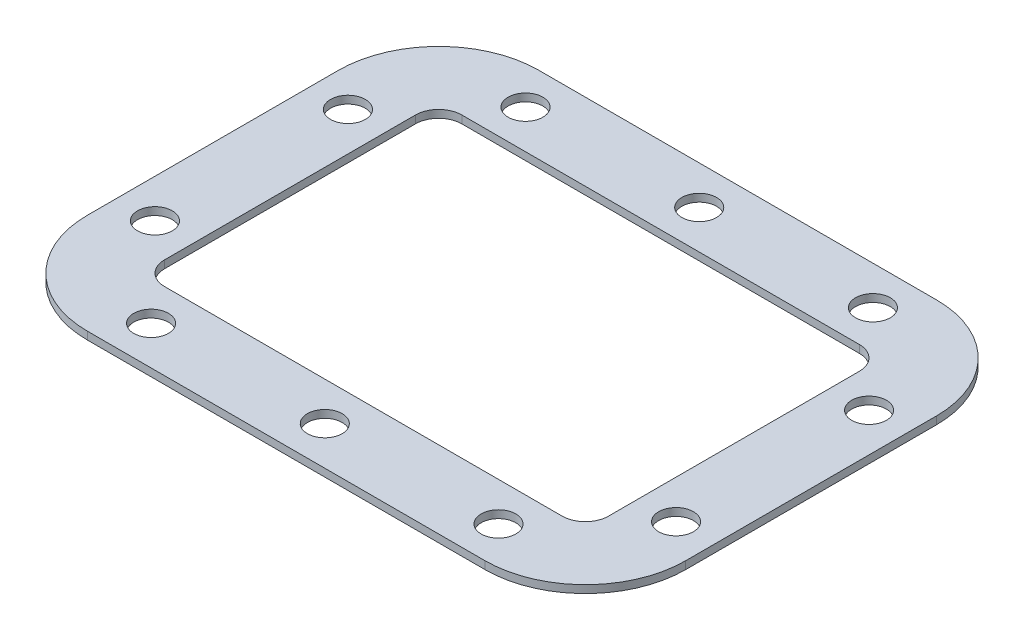
ISO-10303-21;
HEADER;
FILE_DESCRIPTION(('STEP AP214'),'2;1');
FILE_NAME('part.step','',(''),(''),'','','');
FILE_SCHEMA(('AUTOMOTIVE_DESIGN { 1 0 10303 214 1 1 1 1 }'));
ENDSEC;
DATA;
#1=APPLICATION_CONTEXT('core data for automotive mechanical design processes');
#2=APPLICATION_PROTOCOL_DEFINITION('international standard','automotive_design',2000,#1);
#3=PRODUCT_CONTEXT('',#1,'mechanical');
#4=PRODUCT('Part','Part','',(#3));
#5=PRODUCT_RELATED_PRODUCT_CATEGORY('part','',(#4));
#6=PRODUCT_DEFINITION_FORMATION('','',#4);
#7=PRODUCT_DEFINITION_CONTEXT('part definition',#1,'design');
#8=PRODUCT_DEFINITION('design','',#6,#7);
#9=PRODUCT_DEFINITION_SHAPE('','',#8);
#10=(LENGTH_UNIT() NAMED_UNIT(*) SI_UNIT(.MILLI.,.METRE.));
#11=(NAMED_UNIT(*) PLANE_ANGLE_UNIT() SI_UNIT($,.RADIAN.));
#12=(NAMED_UNIT(*) SI_UNIT($,.STERADIAN.) SOLID_ANGLE_UNIT());
#13=UNCERTAINTY_MEASURE_WITH_UNIT(LENGTH_MEASURE(1.E-05),#10,'distance_accuracy_value','');
#14=(GEOMETRIC_REPRESENTATION_CONTEXT(3) GLOBAL_UNCERTAINTY_ASSIGNED_CONTEXT((#13)) GLOBAL_UNIT_ASSIGNED_CONTEXT((#10,
#11,#12)) REPRESENTATION_CONTEXT('',''));
#15=CARTESIAN_POINT('',(0.,0.,0.));
#16=DIRECTION('',(0.,0.,1.));
#17=DIRECTION('',(1.,0.,0.));
#18=AXIS2_PLACEMENT_3D('',#15,#16,#17);
#19=CARTESIAN_POINT('',(51.5,2.,32.5));
#20=DIRECTION('',(0.,1.,0.));
#21=DIRECTION('',(0.,0.,1.));
#22=AXIS2_PLACEMENT_3D('',#19,#20,#21);
#23=PLANE('',#22);
#24=CARTESIAN_POINT('',(-67.5,2.,25.));
#25=DIRECTION('',(0.,1.,0.));
#26=DIRECTION('',(0.,0.,1.));
#27=AXIS2_PLACEMENT_3D('',#24,#25,#26);
#28=CIRCLE('',#27,4.5);
#29=CARTESIAN_POINT('',(-67.5,2.,29.5));
#30=VERTEX_POINT('',#29);
#31=EDGE_CURVE('E426',#30,#30,#28,.T.);
#32=ORIENTED_EDGE('',*,*,#31,.F.);
#33=EDGE_LOOP('',(#32));
#34=FACE_BOUND('',#33,.T.);
#35=CARTESIAN_POINT('',(67.5,2.,-25.));
#36=DIRECTION('',(0.,1.,0.));
#37=DIRECTION('',(0.,0.,1.));
#38=AXIS2_PLACEMENT_3D('',#35,#36,#37);
#39=CIRCLE('',#38,4.5);
#40=CARTESIAN_POINT('',(67.5,2.,-20.5));
#41=VERTEX_POINT('',#40);
#42=EDGE_CURVE('E439',#41,#41,#39,.T.);
#43=ORIENTED_EDGE('',*,*,#42,.F.);
#44=EDGE_LOOP('',(#43));
#45=FACE_BOUND('',#44,.T.);
#46=CARTESIAN_POINT('',(67.5,2.,25.));
#47=DIRECTION('',(0.,1.,0.));
#48=DIRECTION('',(0.,0.,1.));
#49=AXIS2_PLACEMENT_3D('',#46,#47,#48);
#50=CIRCLE('',#49,4.5);
#51=CARTESIAN_POINT('',(67.5,2.,29.5));
#52=VERTEX_POINT('',#51);
#53=EDGE_CURVE('E438',#52,#52,#50,.T.);
#54=ORIENTED_EDGE('',*,*,#53,.F.);
#55=EDGE_LOOP('',(#54));
#56=FACE_BOUND('',#55,.T.);
#57=CARTESIAN_POINT('',(45.,2.,48.5));
#58=DIRECTION('',(0.,1.,0.));
#59=DIRECTION('',(0.,0.,1.));
#60=AXIS2_PLACEMENT_3D('',#57,#58,#59);
#61=CIRCLE('',#60,4.5);
#62=CARTESIAN_POINT('',(45.,2.,53.));
#63=VERTEX_POINT('',#62);
#64=EDGE_CURVE('E451',#63,#63,#61,.T.);
#65=ORIENTED_EDGE('',*,*,#64,.F.);
#66=EDGE_LOOP('',(#65));
#67=FACE_BOUND('',#66,.T.);
#68=CARTESIAN_POINT('',(-45.,2.,-48.5));
#69=DIRECTION('',(0.,1.,0.));
#70=DIRECTION('',(0.,0.,1.));
#71=AXIS2_PLACEMENT_3D('',#68,#69,#70);
#72=CIRCLE('',#71,4.5);
#73=CARTESIAN_POINT('',(-45.,2.,-44.));
#74=VERTEX_POINT('',#73);
#75=EDGE_CURVE('E418',#74,#74,#72,.T.);
#76=ORIENTED_EDGE('',*,*,#75,.F.);
#77=EDGE_LOOP('',(#76));
#78=FACE_BOUND('',#77,.T.);
#79=CARTESIAN_POINT('',(0.,2.,-48.5));
#80=DIRECTION('',(0.,1.,0.));
#81=DIRECTION('',(0.,0.,1.));
#82=AXIS2_PLACEMENT_3D('',#79,#80,#81);
#83=CIRCLE('',#82,4.5);
#84=CARTESIAN_POINT('',(0.,2.,-44.));
#85=VERTEX_POINT('',#84);
#86=EDGE_CURVE('E411',#85,#85,#83,.T.);
#87=ORIENTED_EDGE('',*,*,#86,.F.);
#88=EDGE_LOOP('',(#87));
#89=FACE_BOUND('',#88,.T.);
#90=CARTESIAN_POINT('',(45.,2.,-48.5));
#91=DIRECTION('',(0.,1.,0.));
#92=DIRECTION('',(0.,0.,1.));
#93=AXIS2_PLACEMENT_3D('',#90,#91,#92);
#94=CIRCLE('',#93,4.5);
#95=CARTESIAN_POINT('',(45.,2.,-44.));
#96=VERTEX_POINT('',#95);
#97=EDGE_CURVE('E415',#96,#96,#94,.T.);
#98=ORIENTED_EDGE('',*,*,#97,.F.);
#99=EDGE_LOOP('',(#98));
#100=FACE_BOUND('',#99,.T.);
#101=CARTESIAN_POINT('',(-67.5,2.,-25.));
#102=DIRECTION('',(0.,1.,0.));
#103=DIRECTION('',(0.,0.,1.));
#104=AXIS2_PLACEMENT_3D('',#101,#102,#103);
#105=CIRCLE('',#104,4.5);
#106=CARTESIAN_POINT('',(-67.5,2.,-20.5));
#107=VERTEX_POINT('',#106);
#108=EDGE_CURVE('E427',#107,#107,#105,.T.);
#109=ORIENTED_EDGE('',*,*,#108,.F.);
#110=EDGE_LOOP('',(#109));
#111=FACE_BOUND('',#110,.T.);
#112=CARTESIAN_POINT('',(0.,2.,48.5));
#113=DIRECTION('',(0.,1.,0.));
#114=DIRECTION('',(0.,0.,1.));
#115=AXIS2_PLACEMENT_3D('',#112,#113,#114);
#116=CIRCLE('',#115,4.5);
#117=CARTESIAN_POINT('',(0.,2.,53.));
#118=VERTEX_POINT('',#117);
#119=EDGE_CURVE('E450',#118,#118,#116,.T.);
#120=ORIENTED_EDGE('',*,*,#119,.F.);
#121=EDGE_LOOP('',(#120));
#122=FACE_BOUND('',#121,.T.);
#123=CARTESIAN_POINT('',(-45.,2.,48.5));
#124=DIRECTION('',(0.,1.,0.));
#125=DIRECTION('',(0.,0.,1.));
#126=AXIS2_PLACEMENT_3D('',#123,#124,#125);
#127=CIRCLE('',#126,4.5);
#128=CARTESIAN_POINT('',(-45.,2.,53.));
#129=VERTEX_POINT('',#128);
#130=EDGE_CURVE('E462',#129,#129,#127,.T.);
#131=ORIENTED_EDGE('',*,*,#130,.F.);
#132=EDGE_LOOP('',(#131));
#133=FACE_BOUND('',#132,.T.);
#134=CARTESIAN_POINT('',(51.5,2.,32.5));
#135=DIRECTION('',(0.,1.,0.));
#136=DIRECTION('',(0.,0.,1.));
#137=AXIS2_PLACEMENT_3D('',#134,#135,#136);
#138=CIRCLE('',#137,26.);
#139=CARTESIAN_POINT('',(51.5,2.,58.5));
#140=VERTEX_POINT('',#139);
#141=CARTESIAN_POINT('',(77.5,2.,32.5));
#142=VERTEX_POINT('',#141);
#143=EDGE_CURVE('E218',#140,#142,#138,.T.);
#144=ORIENTED_EDGE('',*,*,#143,.T.);
#145=DIRECTION('',(0.,0.,-1.));
#146=VECTOR('',#145,1.);
#147=CARTESIAN_POINT('',(77.5,2.,32.5));
#148=LINE('',#147,#146);
#149=CARTESIAN_POINT('',(77.5,2.,-32.5));
#150=VERTEX_POINT('',#149);
#151=EDGE_CURVE('E221',#142,#150,#148,.T.);
#152=ORIENTED_EDGE('',*,*,#151,.T.);
#153=CARTESIAN_POINT('',(51.5,2.,-32.5));
#154=DIRECTION('',(0.,1.,0.));
#155=DIRECTION('',(0.,0.,-1.));
#156=AXIS2_PLACEMENT_3D('',#153,#154,#155);
#157=CIRCLE('',#156,26.);
#158=CARTESIAN_POINT('',(51.5,2.,-58.5));
#159=VERTEX_POINT('',#158);
#160=EDGE_CURVE('E224',#150,#159,#157,.T.);
#161=ORIENTED_EDGE('',*,*,#160,.T.);
#162=DIRECTION('',(-1.,0.,0.));
#163=VECTOR('',#162,1.);
#164=CARTESIAN_POINT('',(-51.5,2.,-58.5));
#165=LINE('',#164,#163);
#166=CARTESIAN_POINT('',(-51.5,2.,-58.5));
#167=VERTEX_POINT('',#166);
#168=EDGE_CURVE('E226',#159,#167,#165,.T.);
#169=ORIENTED_EDGE('',*,*,#168,.T.);
#170=CARTESIAN_POINT('',(-51.5,2.,-32.5));
#171=DIRECTION('',(0.,1.,0.));
#172=DIRECTION('',(0.,0.,-1.));
#173=AXIS2_PLACEMENT_3D('',#170,#171,#172);
#174=CIRCLE('',#173,26.);
#175=CARTESIAN_POINT('',(-77.5,2.,-32.5));
#176=VERTEX_POINT('',#175);
#177=EDGE_CURVE('E228',#167,#176,#174,.T.);
#178=ORIENTED_EDGE('',*,*,#177,.T.);
#179=DIRECTION('',(0.,0.,1.));
#180=VECTOR('',#179,1.);
#181=CARTESIAN_POINT('',(-77.5,2.,32.5));
#182=LINE('',#181,#180);
#183=CARTESIAN_POINT('',(-77.5,2.,32.5));
#184=VERTEX_POINT('',#183);
#185=EDGE_CURVE('E230',#176,#184,#182,.T.);
#186=ORIENTED_EDGE('',*,*,#185,.T.);
#187=CARTESIAN_POINT('',(-51.5,2.,32.5));
#188=DIRECTION('',(0.,1.,0.));
#189=DIRECTION('',(0.,0.,-1.));
#190=AXIS2_PLACEMENT_3D('',#187,#188,#189);
#191=CIRCLE('',#190,26.);
#192=CARTESIAN_POINT('',(-51.5,2.,58.5));
#193=VERTEX_POINT('',#192);
#194=EDGE_CURVE('E232',#184,#193,#191,.T.);
#195=ORIENTED_EDGE('',*,*,#194,.T.);
#196=DIRECTION('',(1.,0.,0.));
#197=VECTOR('',#196,1.);
#198=CARTESIAN_POINT('',(-51.5,2.,58.5));
#199=LINE('',#198,#197);
#200=EDGE_CURVE('E234',#193,#140,#199,.T.);
#201=ORIENTED_EDGE('',*,*,#200,.T.);
#202=EDGE_LOOP('',(#144,#152,#161,#169,#178,#186,#195,#201));
#203=FACE_BOUND('',#202,.T.);
#204=DIRECTION('',(0.,0.,1.));
#205=VECTOR('',#204,1.);
#206=CARTESIAN_POINT('',(-57.5,2.,32.5));
#207=LINE('',#206,#205);
#208=CARTESIAN_POINT('',(-57.5,2.,-32.5));
#209=VERTEX_POINT('',#208);
#210=CARTESIAN_POINT('',(-57.5,2.,32.5));
#211=VERTEX_POINT('',#210);
#212=EDGE_CURVE('E159',#209,#211,#207,.T.);
#213=ORIENTED_EDGE('',*,*,#212,.F.);
#214=CARTESIAN_POINT('',(-51.5,2.,-32.5));
#215=DIRECTION('',(0.,1.,0.));
#216=DIRECTION('',(0.,0.,-1.));
#217=AXIS2_PLACEMENT_3D('',#214,#215,#216);
#218=CIRCLE('',#217,6.);
#219=CARTESIAN_POINT('',(-51.5,2.,-38.5));
#220=VERTEX_POINT('',#219);
#221=EDGE_CURVE('E151',#220,#209,#218,.T.);
#222=ORIENTED_EDGE('',*,*,#221,.F.);
#223=DIRECTION('',(-1.,0.,0.));
#224=VECTOR('',#223,1.);
#225=CARTESIAN_POINT('',(-51.5,2.,-38.5));
#226=LINE('',#225,#224);
#227=CARTESIAN_POINT('',(51.5,2.,-38.5));
#228=VERTEX_POINT('',#227);
#229=EDGE_CURVE('E185',#228,#220,#226,.T.);
#230=ORIENTED_EDGE('',*,*,#229,.F.);
#231=CARTESIAN_POINT('',(51.5,2.,-32.5));
#232=DIRECTION('',(0.,1.,0.));
#233=DIRECTION('',(0.,0.,-1.));
#234=AXIS2_PLACEMENT_3D('',#231,#232,#233);
#235=CIRCLE('',#234,6.);
#236=CARTESIAN_POINT('',(57.5,2.,-32.5));
#237=VERTEX_POINT('',#236);
#238=EDGE_CURVE('E183',#237,#228,#235,.T.);
#239=ORIENTED_EDGE('',*,*,#238,.F.);
#240=DIRECTION('',(0.,0.,-1.));
#241=VECTOR('',#240,1.);
#242=CARTESIAN_POINT('',(57.5,2.,32.5));
#243=LINE('',#242,#241);
#244=CARTESIAN_POINT('',(57.5,2.,32.5));
#245=VERTEX_POINT('',#244);
#246=EDGE_CURVE('E181',#245,#237,#243,.T.);
#247=ORIENTED_EDGE('',*,*,#246,.F.);
#248=CARTESIAN_POINT('',(51.5,2.,32.5));
#249=DIRECTION('',(0.,1.,0.));
#250=DIRECTION('',(0.,0.,1.));
#251=AXIS2_PLACEMENT_3D('',#248,#249,#250);
#252=CIRCLE('',#251,6.);
#253=CARTESIAN_POINT('',(51.5,2.,38.5));
#254=VERTEX_POINT('',#253);
#255=EDGE_CURVE('E179',#254,#245,#252,.T.);
#256=ORIENTED_EDGE('',*,*,#255,.F.);
#257=DIRECTION('',(1.,0.,0.));
#258=VECTOR('',#257,1.);
#259=CARTESIAN_POINT('',(-51.5,2.,38.5));
#260=LINE('',#259,#258);
#261=CARTESIAN_POINT('',(-51.5,2.,38.5));
#262=VERTEX_POINT('',#261);
#263=EDGE_CURVE('E174',#262,#254,#260,.T.);
#264=ORIENTED_EDGE('',*,*,#263,.F.);
#265=CARTESIAN_POINT('',(-51.5,2.,32.5));
#266=DIRECTION('',(0.,1.,0.));
#267=DIRECTION('',(0.,0.,-1.));
#268=AXIS2_PLACEMENT_3D('',#265,#266,#267);
#269=CIRCLE('',#268,6.);
#270=EDGE_CURVE('E172',#211,#262,#269,.T.);
#271=ORIENTED_EDGE('',*,*,#270,.F.);
#272=EDGE_LOOP('',(#213,#222,#230,#239,#247,#256,#264,#271));
#273=FACE_BOUND('',#272,.T.);
#274=ADVANCED_FACE('F38',(#34,#45,#56,#67,#78,#89,#100,#111,#122,#133,#203,#273),#23,.T.);
#275=CARTESIAN_POINT('',(51.5,0.,32.5));
#276=DIRECTION('',(0.,1.,0.));
#277=DIRECTION('',(0.,0.,1.));
#278=AXIS2_PLACEMENT_3D('',#275,#276,#277);
#279=PLANE('',#278);
#280=CARTESIAN_POINT('',(-67.5,0.,25.));
#281=DIRECTION('',(0.,1.,0.));
#282=DIRECTION('',(0.,0.,1.));
#283=AXIS2_PLACEMENT_3D('',#280,#281,#282);
#284=CIRCLE('',#283,4.5);
#285=CARTESIAN_POINT('',(-67.5,0.,29.5));
#286=VERTEX_POINT('',#285);
#287=EDGE_CURVE('E442',#286,#286,#284,.T.);
#288=ORIENTED_EDGE('',*,*,#287,.T.);
#289=EDGE_LOOP('',(#288));
#290=FACE_BOUND('',#289,.T.);
#291=CARTESIAN_POINT('',(67.5,0.,-25.));
#292=DIRECTION('',(0.,1.,0.));
#293=DIRECTION('',(0.,0.,1.));
#294=AXIS2_PLACEMENT_3D('',#291,#292,#293);
#295=CIRCLE('',#294,4.5);
#296=CARTESIAN_POINT('',(67.5,0.,-20.5));
#297=VERTEX_POINT('',#296);
#298=EDGE_CURVE('E435',#297,#297,#295,.T.);
#299=ORIENTED_EDGE('',*,*,#298,.T.);
#300=EDGE_LOOP('',(#299));
#301=FACE_BOUND('',#300,.T.);
#302=CARTESIAN_POINT('',(67.5,0.,25.));
#303=DIRECTION('',(0.,1.,0.));
#304=DIRECTION('',(0.,0.,1.));
#305=AXIS2_PLACEMENT_3D('',#302,#303,#304);
#306=CIRCLE('',#305,4.5);
#307=CARTESIAN_POINT('',(67.5,0.,29.5));
#308=VERTEX_POINT('',#307);
#309=EDGE_CURVE('E454',#308,#308,#306,.T.);
#310=ORIENTED_EDGE('',*,*,#309,.T.);
#311=EDGE_LOOP('',(#310));
#312=FACE_BOUND('',#311,.T.);
#313=CARTESIAN_POINT('',(45.,0.,48.5));
#314=DIRECTION('',(0.,1.,0.));
#315=DIRECTION('',(0.,0.,1.));
#316=AXIS2_PLACEMENT_3D('',#313,#314,#315);
#317=CIRCLE('',#316,4.5);
#318=CARTESIAN_POINT('',(45.,0.,53.));
#319=VERTEX_POINT('',#318);
#320=EDGE_CURVE('E447',#319,#319,#317,.T.);
#321=ORIENTED_EDGE('',*,*,#320,.T.);
#322=EDGE_LOOP('',(#321));
#323=FACE_BOUND('',#322,.T.);
#324=CARTESIAN_POINT('',(-45.,0.,-48.5));
#325=DIRECTION('',(0.,1.,0.));
#326=DIRECTION('',(0.,0.,1.));
#327=AXIS2_PLACEMENT_3D('',#324,#325,#326);
#328=CIRCLE('',#327,4.5);
#329=CARTESIAN_POINT('',(-45.,0.,-44.));
#330=VERTEX_POINT('',#329);
#331=EDGE_CURVE('E413',#330,#330,#328,.T.);
#332=ORIENTED_EDGE('',*,*,#331,.T.);
#333=EDGE_LOOP('',(#332));
#334=FACE_BOUND('',#333,.T.);
#335=CARTESIAN_POINT('',(0.,0.,-48.5));
#336=DIRECTION('',(0.,1.,0.));
#337=DIRECTION('',(0.,0.,1.));
#338=AXIS2_PLACEMENT_3D('',#335,#336,#337);
#339=CIRCLE('',#338,4.5);
#340=CARTESIAN_POINT('',(0.,0.,-44.));
#341=VERTEX_POINT('',#340);
#342=EDGE_CURVE('E408',#341,#341,#339,.T.);
#343=ORIENTED_EDGE('',*,*,#342,.T.);
#344=EDGE_LOOP('',(#343));
#345=FACE_BOUND('',#344,.T.);
#346=CARTESIAN_POINT('',(45.,0.,-48.5));
#347=DIRECTION('',(0.,1.,0.));
#348=DIRECTION('',(0.,0.,1.));
#349=AXIS2_PLACEMENT_3D('',#346,#347,#348);
#350=CIRCLE('',#349,4.5);
#351=CARTESIAN_POINT('',(45.,0.,-44.));
#352=VERTEX_POINT('',#351);
#353=EDGE_CURVE('E430',#352,#352,#350,.T.);
#354=ORIENTED_EDGE('',*,*,#353,.T.);
#355=EDGE_LOOP('',(#354));
#356=FACE_BOUND('',#355,.T.);
#357=CARTESIAN_POINT('',(-67.5,0.,-25.));
#358=DIRECTION('',(0.,1.,0.));
#359=DIRECTION('',(0.,0.,1.));
#360=AXIS2_PLACEMENT_3D('',#357,#358,#359);
#361=CIRCLE('',#360,4.5);
#362=CARTESIAN_POINT('',(-67.5,0.,-20.5));
#363=VERTEX_POINT('',#362);
#364=EDGE_CURVE('E423',#363,#363,#361,.T.);
#365=ORIENTED_EDGE('',*,*,#364,.T.);
#366=EDGE_LOOP('',(#365));
#367=FACE_BOUND('',#366,.T.);
#368=CARTESIAN_POINT('',(0.,0.,48.5));
#369=DIRECTION('',(0.,1.,0.));
#370=DIRECTION('',(0.,0.,1.));
#371=AXIS2_PLACEMENT_3D('',#368,#369,#370);
#372=CIRCLE('',#371,4.5);
#373=CARTESIAN_POINT('',(0.,0.,53.));
#374=VERTEX_POINT('',#373);
#375=EDGE_CURVE('E459',#374,#374,#372,.T.);
#376=ORIENTED_EDGE('',*,*,#375,.T.);
#377=EDGE_LOOP('',(#376));
#378=FACE_BOUND('',#377,.T.);
#379=CARTESIAN_POINT('',(-45.,0.,48.5));
#380=DIRECTION('',(0.,1.,0.));
#381=DIRECTION('',(0.,0.,1.));
#382=AXIS2_PLACEMENT_3D('',#379,#380,#381);
#383=CIRCLE('',#382,4.5);
#384=CARTESIAN_POINT('',(-45.,0.,53.));
#385=VERTEX_POINT('',#384);
#386=EDGE_CURVE('E188',#385,#385,#383,.T.);
#387=ORIENTED_EDGE('',*,*,#386,.T.);
#388=EDGE_LOOP('',(#387));
#389=FACE_BOUND('',#388,.T.);
#390=CARTESIAN_POINT('',(51.5,0.,32.5));
#391=DIRECTION('',(0.,1.,0.));
#392=DIRECTION('',(0.,0.,1.));
#393=AXIS2_PLACEMENT_3D('',#390,#391,#392);
#394=CIRCLE('',#393,26.);
#395=CARTESIAN_POINT('',(51.5,0.,58.5));
#396=VERTEX_POINT('',#395);
#397=CARTESIAN_POINT('',(77.5,0.,32.5));
#398=VERTEX_POINT('',#397);
#399=EDGE_CURVE('E167',#396,#398,#394,.T.);
#400=ORIENTED_EDGE('',*,*,#399,.F.);
#401=DIRECTION('',(1.,0.,0.));
#402=VECTOR('',#401,1.);
#403=CARTESIAN_POINT('',(-51.5,0.,58.5));
#404=LINE('',#403,#402);
#405=CARTESIAN_POINT('',(-51.5,0.,58.5));
#406=VERTEX_POINT('',#405);
#407=EDGE_CURVE('E222',#406,#396,#404,.T.);
#408=ORIENTED_EDGE('',*,*,#407,.F.);
#409=CARTESIAN_POINT('',(-51.5,0.,32.5));
#410=DIRECTION('',(0.,1.,0.));
#411=DIRECTION('',(0.,0.,-1.));
#412=AXIS2_PLACEMENT_3D('',#409,#410,#411);
#413=CIRCLE('',#412,26.);
#414=CARTESIAN_POINT('',(-77.5,0.,32.5));
#415=VERTEX_POINT('',#414);
#416=EDGE_CURVE('E249',#415,#406,#413,.T.);
#417=ORIENTED_EDGE('',*,*,#416,.F.);
#418=DIRECTION('',(0.,0.,1.));
#419=VECTOR('',#418,1.);
#420=CARTESIAN_POINT('',(-77.5,0.,32.5));
#421=LINE('',#420,#419);
#422=CARTESIAN_POINT('',(-77.5,0.,-32.5));
#423=VERTEX_POINT('',#422);
#424=EDGE_CURVE('E247',#423,#415,#421,.T.);
#425=ORIENTED_EDGE('',*,*,#424,.F.);
#426=CARTESIAN_POINT('',(-51.5,0.,-32.5));
#427=DIRECTION('',(0.,1.,0.));
#428=DIRECTION('',(0.,0.,-1.));
#429=AXIS2_PLACEMENT_3D('',#426,#427,#428);
#430=CIRCLE('',#429,26.);
#431=CARTESIAN_POINT('',(-51.5,0.,-58.5));
#432=VERTEX_POINT('',#431);
#433=EDGE_CURVE('E245',#432,#423,#430,.T.);
#434=ORIENTED_EDGE('',*,*,#433,.F.);
#435=DIRECTION('',(-1.,0.,0.));
#436=VECTOR('',#435,1.);
#437=CARTESIAN_POINT('',(-51.5,0.,-58.5));
#438=LINE('',#437,#436);
#439=CARTESIAN_POINT('',(51.5,0.,-58.5));
#440=VERTEX_POINT('',#439);
#441=EDGE_CURVE('E243',#440,#432,#438,.T.);
#442=ORIENTED_EDGE('',*,*,#441,.F.);
#443=CARTESIAN_POINT('',(51.5,0.,-32.5));
#444=DIRECTION('',(0.,1.,0.));
#445=DIRECTION('',(0.,0.,-1.));
#446=AXIS2_PLACEMENT_3D('',#443,#444,#445);
#447=CIRCLE('',#446,26.);
#448=CARTESIAN_POINT('',(77.5,0.,-32.5));
#449=VERTEX_POINT('',#448);
#450=EDGE_CURVE('E241',#449,#440,#447,.T.);
#451=ORIENTED_EDGE('',*,*,#450,.F.);
#452=DIRECTION('',(0.,0.,-1.));
#453=VECTOR('',#452,1.);
#454=CARTESIAN_POINT('',(77.5,0.,32.5));
#455=LINE('',#454,#453);
#456=EDGE_CURVE('E239',#398,#449,#455,.T.);
#457=ORIENTED_EDGE('',*,*,#456,.F.);
#458=EDGE_LOOP('',(#400,#408,#417,#425,#434,#442,#451,#457));
#459=FACE_BOUND('',#458,.T.);
#460=CARTESIAN_POINT('',(-51.5,0.,-32.5));
#461=DIRECTION('',(0.,1.,0.));
#462=DIRECTION('',(0.,0.,-1.));
#463=AXIS2_PLACEMENT_3D('',#460,#461,#462);
#464=CIRCLE('',#463,6.);
#465=CARTESIAN_POINT('',(-51.5,0.,-38.5));
#466=VERTEX_POINT('',#465);
#467=CARTESIAN_POINT('',(-57.5,0.,-32.5));
#468=VERTEX_POINT('',#467);
#469=EDGE_CURVE('E61',#466,#468,#464,.T.);
#470=ORIENTED_EDGE('',*,*,#469,.T.);
#471=DIRECTION('',(0.,0.,1.));
#472=VECTOR('',#471,1.);
#473=CARTESIAN_POINT('',(-57.5,0.,32.5));
#474=LINE('',#473,#472);
#475=CARTESIAN_POINT('',(-57.5,0.,32.5));
#476=VERTEX_POINT('',#475);
#477=EDGE_CURVE('E166',#468,#476,#474,.T.);
#478=ORIENTED_EDGE('',*,*,#477,.T.);
#479=CARTESIAN_POINT('',(-51.5,0.,32.5));
#480=DIRECTION('',(0.,1.,0.));
#481=DIRECTION('',(0.,0.,-1.));
#482=AXIS2_PLACEMENT_3D('',#479,#480,#481);
#483=CIRCLE('',#482,6.);
#484=CARTESIAN_POINT('',(-51.5,0.,38.5));
#485=VERTEX_POINT('',#484);
#486=EDGE_CURVE('E190',#476,#485,#483,.T.);
#487=ORIENTED_EDGE('',*,*,#486,.T.);
#488=DIRECTION('',(1.,0.,0.));
#489=VECTOR('',#488,1.);
#490=CARTESIAN_POINT('',(-51.5,0.,38.5));
#491=LINE('',#490,#489);
#492=CARTESIAN_POINT('',(51.5,0.,38.5));
#493=VERTEX_POINT('',#492);
#494=EDGE_CURVE('E193',#485,#493,#491,.T.);
#495=ORIENTED_EDGE('',*,*,#494,.T.);
#496=CARTESIAN_POINT('',(51.5,0.,32.5));
#497=DIRECTION('',(0.,1.,0.));
#498=DIRECTION('',(0.,0.,1.));
#499=AXIS2_PLACEMENT_3D('',#496,#497,#498);
#500=CIRCLE('',#499,6.);
#501=CARTESIAN_POINT('',(57.5,0.,32.5));
#502=VERTEX_POINT('',#501);
#503=EDGE_CURVE('E196',#493,#502,#500,.T.);
#504=ORIENTED_EDGE('',*,*,#503,.T.);
#505=DIRECTION('',(0.,0.,-1.));
#506=VECTOR('',#505,1.);
#507=CARTESIAN_POINT('',(57.5,0.,32.5));
#508=LINE('',#507,#506);
#509=CARTESIAN_POINT('',(57.5,0.,-32.5));
#510=VERTEX_POINT('',#509);
#511=EDGE_CURVE('E199',#502,#510,#508,.T.);
#512=ORIENTED_EDGE('',*,*,#511,.T.);
#513=CARTESIAN_POINT('',(51.5,0.,-32.5));
#514=DIRECTION('',(0.,1.,0.));
#515=DIRECTION('',(0.,0.,-1.));
#516=AXIS2_PLACEMENT_3D('',#513,#514,#515);
#517=CIRCLE('',#516,6.);
#518=CARTESIAN_POINT('',(51.5,0.,-38.5));
#519=VERTEX_POINT('',#518);
#520=EDGE_CURVE('E202',#510,#519,#517,.T.);
#521=ORIENTED_EDGE('',*,*,#520,.T.);
#522=DIRECTION('',(-1.,0.,0.));
#523=VECTOR('',#522,1.);
#524=CARTESIAN_POINT('',(-51.5,0.,-38.5));
#525=LINE('',#524,#523);
#526=EDGE_CURVE('E160',#519,#466,#525,.T.);
#527=ORIENTED_EDGE('',*,*,#526,.T.);
#528=EDGE_LOOP('',(#470,#478,#487,#495,#504,#512,#521,#527));
#529=FACE_BOUND('',#528,.T.);
#530=ADVANCED_FACE('F279',(#290,#301,#312,#323,#334,#345,#356,#367,#378,#389,#459,#529),#279,.F.);
#531=CARTESIAN_POINT('',(51.5,2.,32.5));
#532=DIRECTION('',(0.,-1.,0.));
#533=DIRECTION('',(0.,0.,-1.));
#534=AXIS2_PLACEMENT_3D('',#531,#532,#533);
#535=CYLINDRICAL_SURFACE('',#534,26.);
#536=ORIENTED_EDGE('',*,*,#399,.T.);
#537=DIRECTION('',(0.,-1.,0.));
#538=VECTOR('',#537,1.);
#539=CARTESIAN_POINT('',(77.5,2.,32.5));
#540=LINE('',#539,#538);
#541=EDGE_CURVE('E11',#142,#398,#540,.T.);
#542=ORIENTED_EDGE('',*,*,#541,.F.);
#543=ORIENTED_EDGE('',*,*,#143,.F.);
#544=DIRECTION('',(0.,-1.,0.));
#545=VECTOR('',#544,1.);
#546=CARTESIAN_POINT('',(51.5,2.,58.5));
#547=LINE('',#546,#545);
#548=EDGE_CURVE('E236',#140,#396,#547,.T.);
#549=ORIENTED_EDGE('',*,*,#548,.T.);
#550=EDGE_LOOP('',(#536,#542,#543,#549));
#551=FACE_BOUND('',#550,.T.);
#552=ADVANCED_FACE('F40',(#551),#535,.T.);
#553=CARTESIAN_POINT('',(77.5,2.,32.5));
#554=DIRECTION('',(-1.,0.,0.));
#555=DIRECTION('',(0.,0.,1.));
#556=AXIS2_PLACEMENT_3D('',#553,#554,#555);
#557=PLANE('',#556);
#558=ORIENTED_EDGE('',*,*,#456,.T.);
#559=DIRECTION('',(0.,-1.,0.));
#560=VECTOR('',#559,1.);
#561=CARTESIAN_POINT('',(77.5,2.,-32.5));
#562=LINE('',#561,#560);
#563=EDGE_CURVE('E46',#150,#449,#562,.T.);
#564=ORIENTED_EDGE('',*,*,#563,.F.);
#565=ORIENTED_EDGE('',*,*,#151,.F.);
#566=ORIENTED_EDGE('',*,*,#541,.T.);
#567=EDGE_LOOP('',(#558,#564,#565,#566));
#568=FACE_BOUND('',#567,.T.);
#569=ADVANCED_FACE('F296',(#568),#557,.F.);
#570=CARTESIAN_POINT('',(51.5,2.,-32.5));
#571=DIRECTION('',(0.,-1.,0.));
#572=DIRECTION('',(0.,0.,-1.));
#573=AXIS2_PLACEMENT_3D('',#570,#571,#572);
#574=CYLINDRICAL_SURFACE('',#573,26.);
#575=ORIENTED_EDGE('',*,*,#450,.T.);
#576=DIRECTION('',(0.,-1.,0.));
#577=VECTOR('',#576,1.);
#578=CARTESIAN_POINT('',(51.5,2.,-58.5));
#579=LINE('',#578,#577);
#580=EDGE_CURVE('E266',#159,#440,#579,.T.);
#581=ORIENTED_EDGE('',*,*,#580,.F.);
#582=ORIENTED_EDGE('',*,*,#160,.F.);
#583=ORIENTED_EDGE('',*,*,#563,.T.);
#584=EDGE_LOOP('',(#575,#581,#582,#583));
#585=FACE_BOUND('',#584,.T.);
#586=ADVANCED_FACE('F273',(#585),#574,.T.);
#587=CARTESIAN_POINT('',(-51.5,2.,-58.5));
#588=DIRECTION('',(0.,0.,1.));
#589=DIRECTION('',(1.,0.,0.));
#590=AXIS2_PLACEMENT_3D('',#587,#588,#589);
#591=PLANE('',#590);
#592=ORIENTED_EDGE('',*,*,#441,.T.);
#593=DIRECTION('',(0.,-1.,0.));
#594=VECTOR('',#593,1.);
#595=CARTESIAN_POINT('',(-51.5,2.,-58.5));
#596=LINE('',#595,#594);
#597=EDGE_CURVE('E263',#167,#432,#596,.T.);
#598=ORIENTED_EDGE('',*,*,#597,.F.);
#599=ORIENTED_EDGE('',*,*,#168,.F.);
#600=ORIENTED_EDGE('',*,*,#580,.T.);
#601=EDGE_LOOP('',(#592,#598,#599,#600));
#602=FACE_BOUND('',#601,.T.);
#603=ADVANCED_FACE('F285',(#602),#591,.F.);
#604=CARTESIAN_POINT('',(-51.5,2.,-32.5));
#605=DIRECTION('',(0.,-1.,0.));
#606=DIRECTION('',(0.,0.,-1.));
#607=AXIS2_PLACEMENT_3D('',#604,#605,#606);
#608=CYLINDRICAL_SURFACE('',#607,26.);
#609=ORIENTED_EDGE('',*,*,#433,.T.);
#610=DIRECTION('',(0.,-1.,0.));
#611=VECTOR('',#610,1.);
#612=CARTESIAN_POINT('',(-77.5,2.,-32.5));
#613=LINE('',#612,#611);
#614=EDGE_CURVE('E260',#176,#423,#613,.T.);
#615=ORIENTED_EDGE('',*,*,#614,.F.);
#616=ORIENTED_EDGE('',*,*,#177,.F.);
#617=ORIENTED_EDGE('',*,*,#597,.T.);
#618=EDGE_LOOP('',(#609,#615,#616,#617));
#619=FACE_BOUND('',#618,.T.);
#620=ADVANCED_FACE('F289',(#619),#608,.T.);
#621=CARTESIAN_POINT('',(-77.5,2.,32.5));
#622=DIRECTION('',(1.,0.,0.));
#623=DIRECTION('',(0.,0.,-1.));
#624=AXIS2_PLACEMENT_3D('',#621,#622,#623);
#625=PLANE('',#624);
#626=ORIENTED_EDGE('',*,*,#424,.T.);
#627=DIRECTION('',(0.,-1.,0.));
#628=VECTOR('',#627,1.);
#629=CARTESIAN_POINT('',(-77.5,2.,32.5));
#630=LINE('',#629,#628);
#631=EDGE_CURVE('E257',#184,#415,#630,.T.);
#632=ORIENTED_EDGE('',*,*,#631,.F.);
#633=ORIENTED_EDGE('',*,*,#185,.F.);
#634=ORIENTED_EDGE('',*,*,#614,.T.);
#635=EDGE_LOOP('',(#626,#632,#633,#634));
#636=FACE_BOUND('',#635,.T.);
#637=ADVANCED_FACE('F309',(#636),#625,.F.);
#638=CARTESIAN_POINT('',(-51.5,2.,32.5));
#639=DIRECTION('',(0.,-1.,0.));
#640=DIRECTION('',(0.,0.,-1.));
#641=AXIS2_PLACEMENT_3D('',#638,#639,#640);
#642=CYLINDRICAL_SURFACE('',#641,26.);
#643=ORIENTED_EDGE('',*,*,#416,.T.);
#644=DIRECTION('',(0.,-1.,0.));
#645=VECTOR('',#644,1.);
#646=CARTESIAN_POINT('',(-51.5,2.,58.5));
#647=LINE('',#646,#645);
#648=EDGE_CURVE('E254',#193,#406,#647,.T.);
#649=ORIENTED_EDGE('',*,*,#648,.F.);
#650=ORIENTED_EDGE('',*,*,#194,.F.);
#651=ORIENTED_EDGE('',*,*,#631,.T.);
#652=EDGE_LOOP('',(#643,#649,#650,#651));
#653=FACE_BOUND('',#652,.T.);
#654=ADVANCED_FACE('F307',(#653),#642,.T.);
#655=CARTESIAN_POINT('',(-51.5,2.,58.5));
#656=DIRECTION('',(0.,0.,-1.));
#657=DIRECTION('',(-1.,0.,0.));
#658=AXIS2_PLACEMENT_3D('',#655,#656,#657);
#659=PLANE('',#658);
#660=ORIENTED_EDGE('',*,*,#407,.T.);
#661=ORIENTED_EDGE('',*,*,#548,.F.);
#662=ORIENTED_EDGE('',*,*,#200,.F.);
#663=ORIENTED_EDGE('',*,*,#648,.T.);
#664=EDGE_LOOP('',(#660,#661,#662,#663));
#665=FACE_BOUND('',#664,.T.);
#666=ADVANCED_FACE('F302',(#665),#659,.F.);
#667=CARTESIAN_POINT('',(-51.5,2.,-32.5));
#668=DIRECTION('',(0.,-1.,0.));
#669=DIRECTION('',(0.,0.,-1.));
#670=AXIS2_PLACEMENT_3D('',#667,#668,#669);
#671=CYLINDRICAL_SURFACE('',#670,6.);
#672=ORIENTED_EDGE('',*,*,#469,.F.);
#673=DIRECTION('',(0.,-1.,0.));
#674=VECTOR('',#673,1.);
#675=CARTESIAN_POINT('',(-51.5,2.,-38.5));
#676=LINE('',#675,#674);
#677=EDGE_CURVE('E155',#220,#466,#676,.T.);
#678=ORIENTED_EDGE('',*,*,#677,.F.);
#679=ORIENTED_EDGE('',*,*,#221,.T.);
#680=DIRECTION('',(0.,-1.,0.));
#681=VECTOR('',#680,1.);
#682=CARTESIAN_POINT('',(-57.5,2.,-32.5));
#683=LINE('',#682,#681);
#684=EDGE_CURVE('E154',#209,#468,#683,.T.);
#685=ORIENTED_EDGE('',*,*,#684,.T.);
#686=EDGE_LOOP('',(#672,#678,#679,#685));
#687=FACE_BOUND('',#686,.T.);
#688=ADVANCED_FACE('F153',(#687),#671,.F.);
#689=CARTESIAN_POINT('',(-57.5,2.,32.5));
#690=DIRECTION('',(1.,0.,0.));
#691=DIRECTION('',(0.,0.,-1.));
#692=AXIS2_PLACEMENT_3D('',#689,#690,#691);
#693=PLANE('',#692);
#694=ORIENTED_EDGE('',*,*,#477,.F.);
#695=ORIENTED_EDGE('',*,*,#684,.F.);
#696=ORIENTED_EDGE('',*,*,#212,.T.);
#697=DIRECTION('',(0.,-1.,0.));
#698=VECTOR('',#697,1.);
#699=CARTESIAN_POINT('',(-57.5,2.,32.5));
#700=LINE('',#699,#698);
#701=EDGE_CURVE('E168',#211,#476,#700,.T.);
#702=ORIENTED_EDGE('',*,*,#701,.T.);
#703=EDGE_LOOP('',(#694,#695,#696,#702));
#704=FACE_BOUND('',#703,.T.);
#705=ADVANCED_FACE('F163',(#704),#693,.T.);
#706=CARTESIAN_POINT('',(-51.5,2.,32.5));
#707=DIRECTION('',(0.,-1.,0.));
#708=DIRECTION('',(0.,0.,-1.));
#709=AXIS2_PLACEMENT_3D('',#706,#707,#708);
#710=CYLINDRICAL_SURFACE('',#709,6.);
#711=ORIENTED_EDGE('',*,*,#486,.F.);
#712=ORIENTED_EDGE('',*,*,#701,.F.);
#713=ORIENTED_EDGE('',*,*,#270,.T.);
#714=DIRECTION('',(0.,-1.,0.));
#715=VECTOR('',#714,1.);
#716=CARTESIAN_POINT('',(-51.5,2.,38.5));
#717=LINE('',#716,#715);
#718=EDGE_CURVE('E215',#262,#485,#717,.T.);
#719=ORIENTED_EDGE('',*,*,#718,.T.);
#720=EDGE_LOOP('',(#711,#712,#713,#719));
#721=FACE_BOUND('',#720,.T.);
#722=ADVANCED_FACE('F338',(#721),#710,.F.);
#723=CARTESIAN_POINT('',(-51.5,2.,38.5));
#724=DIRECTION('',(0.,0.,-1.));
#725=DIRECTION('',(-1.,0.,0.));
#726=AXIS2_PLACEMENT_3D('',#723,#724,#725);
#727=PLANE('',#726);
#728=ORIENTED_EDGE('',*,*,#494,.F.);
#729=ORIENTED_EDGE('',*,*,#718,.F.);
#730=ORIENTED_EDGE('',*,*,#263,.T.);
#731=DIRECTION('',(0.,-1.,0.));
#732=VECTOR('',#731,1.);
#733=CARTESIAN_POINT('',(51.5,2.,38.5));
#734=LINE('',#733,#732);
#735=EDGE_CURVE('E213',#254,#493,#734,.T.);
#736=ORIENTED_EDGE('',*,*,#735,.T.);
#737=EDGE_LOOP('',(#728,#729,#730,#736));
#738=FACE_BOUND('',#737,.T.);
#739=ADVANCED_FACE('F342',(#738),#727,.T.);
#740=CARTESIAN_POINT('',(51.5,2.,32.5));
#741=DIRECTION('',(0.,-1.,0.));
#742=DIRECTION('',(0.,0.,-1.));
#743=AXIS2_PLACEMENT_3D('',#740,#741,#742);
#744=CYLINDRICAL_SURFACE('',#743,6.);
#745=ORIENTED_EDGE('',*,*,#503,.F.);
#746=ORIENTED_EDGE('',*,*,#735,.F.);
#747=ORIENTED_EDGE('',*,*,#255,.T.);
#748=DIRECTION('',(0.,-1.,0.));
#749=VECTOR('',#748,1.);
#750=CARTESIAN_POINT('',(57.5,2.,32.5));
#751=LINE('',#750,#749);
#752=EDGE_CURVE('E211',#245,#502,#751,.T.);
#753=ORIENTED_EDGE('',*,*,#752,.T.);
#754=EDGE_LOOP('',(#745,#746,#747,#753));
#755=FACE_BOUND('',#754,.T.);
#756=ADVANCED_FACE('F348',(#755),#744,.F.);
#757=CARTESIAN_POINT('',(57.5,2.,32.5));
#758=DIRECTION('',(-1.,0.,0.));
#759=DIRECTION('',(0.,0.,1.));
#760=AXIS2_PLACEMENT_3D('',#757,#758,#759);
#761=PLANE('',#760);
#762=ORIENTED_EDGE('',*,*,#511,.F.);
#763=ORIENTED_EDGE('',*,*,#752,.F.);
#764=ORIENTED_EDGE('',*,*,#246,.T.);
#765=DIRECTION('',(0.,-1.,0.));
#766=VECTOR('',#765,1.);
#767=CARTESIAN_POINT('',(57.5,2.,-32.5));
#768=LINE('',#767,#766);
#769=EDGE_CURVE('E209',#237,#510,#768,.T.);
#770=ORIENTED_EDGE('',*,*,#769,.T.);
#771=EDGE_LOOP('',(#762,#763,#764,#770));
#772=FACE_BOUND('',#771,.T.);
#773=ADVANCED_FACE('F352',(#772),#761,.T.);
#774=CARTESIAN_POINT('',(51.5,2.,-32.5));
#775=DIRECTION('',(0.,-1.,0.));
#776=DIRECTION('',(0.,0.,-1.));
#777=AXIS2_PLACEMENT_3D('',#774,#775,#776);
#778=CYLINDRICAL_SURFACE('',#777,6.);
#779=ORIENTED_EDGE('',*,*,#520,.F.);
#780=ORIENTED_EDGE('',*,*,#769,.F.);
#781=ORIENTED_EDGE('',*,*,#238,.T.);
#782=DIRECTION('',(0.,-1.,0.));
#783=VECTOR('',#782,1.);
#784=CARTESIAN_POINT('',(51.5,2.,-38.5));
#785=LINE('',#784,#783);
#786=EDGE_CURVE('E53',#228,#519,#785,.T.);
#787=ORIENTED_EDGE('',*,*,#786,.T.);
#788=EDGE_LOOP('',(#779,#780,#781,#787));
#789=FACE_BOUND('',#788,.T.);
#790=ADVANCED_FACE('F356',(#789),#778,.F.);
#791=CARTESIAN_POINT('',(-51.5,2.,-38.5));
#792=DIRECTION('',(0.,0.,1.));
#793=DIRECTION('',(1.,0.,0.));
#794=AXIS2_PLACEMENT_3D('',#791,#792,#793);
#795=PLANE('',#794);
#796=ORIENTED_EDGE('',*,*,#526,.F.);
#797=ORIENTED_EDGE('',*,*,#786,.F.);
#798=ORIENTED_EDGE('',*,*,#229,.T.);
#799=ORIENTED_EDGE('',*,*,#677,.T.);
#800=EDGE_LOOP('',(#796,#797,#798,#799));
#801=FACE_BOUND('',#800,.T.);
#802=ADVANCED_FACE('F360',(#801),#795,.T.);
#803=CARTESIAN_POINT('',(-45.,0.,48.5));
#804=DIRECTION('',(0.,1.,0.));
#805=DIRECTION('',(0.,0.,1.));
#806=AXIS2_PLACEMENT_3D('',#803,#804,#805);
#807=CYLINDRICAL_SURFACE('',#806,4.5);
#808=ORIENTED_EDGE('',*,*,#386,.F.);
#809=EDGE_LOOP('',(#808));
#810=FACE_BOUND('',#809,.T.);
#811=ORIENTED_EDGE('',*,*,#130,.T.);
#812=EDGE_LOOP('',(#811));
#813=FACE_BOUND('',#812,.T.);
#814=ADVANCED_FACE('F364',(#810,#813),#807,.F.);
#815=CARTESIAN_POINT('',(0.,0.,48.5));
#816=DIRECTION('',(0.,1.,0.));
#817=DIRECTION('',(0.,0.,1.));
#818=AXIS2_PLACEMENT_3D('',#815,#816,#817);
#819=CYLINDRICAL_SURFACE('',#818,4.5);
#820=ORIENTED_EDGE('',*,*,#375,.F.);
#821=EDGE_LOOP('',(#820));
#822=FACE_BOUND('',#821,.T.);
#823=ORIENTED_EDGE('',*,*,#119,.T.);
#824=EDGE_LOOP('',(#823));
#825=FACE_BOUND('',#824,.T.);
#826=ADVANCED_FACE('F367',(#822,#825),#819,.F.);
#827=CARTESIAN_POINT('',(-67.5,0.,-25.));
#828=DIRECTION('',(0.,1.,0.));
#829=DIRECTION('',(0.,0.,1.));
#830=AXIS2_PLACEMENT_3D('',#827,#828,#829);
#831=CYLINDRICAL_SURFACE('',#830,4.5);
#832=ORIENTED_EDGE('',*,*,#364,.F.);
#833=EDGE_LOOP('',(#832));
#834=FACE_BOUND('',#833,.T.);
#835=ORIENTED_EDGE('',*,*,#108,.T.);
#836=EDGE_LOOP('',(#835));
#837=FACE_BOUND('',#836,.T.);
#838=ADVANCED_FACE('F371',(#834,#837),#831,.F.);
#839=CARTESIAN_POINT('',(45.,0.,-48.5));
#840=DIRECTION('',(0.,1.,0.));
#841=DIRECTION('',(0.,0.,1.));
#842=AXIS2_PLACEMENT_3D('',#839,#840,#841);
#843=CYLINDRICAL_SURFACE('',#842,4.5);
#844=ORIENTED_EDGE('',*,*,#353,.F.);
#845=EDGE_LOOP('',(#844));
#846=FACE_BOUND('',#845,.T.);
#847=ORIENTED_EDGE('',*,*,#97,.T.);
#848=EDGE_LOOP('',(#847));
#849=FACE_BOUND('',#848,.T.);
#850=ADVANCED_FACE('F390',(#846,#849),#843,.F.);
#851=CARTESIAN_POINT('',(0.,0.,-48.5));
#852=DIRECTION('',(0.,1.,0.));
#853=DIRECTION('',(0.,0.,1.));
#854=AXIS2_PLACEMENT_3D('',#851,#852,#853);
#855=CYLINDRICAL_SURFACE('',#854,4.5);
#856=ORIENTED_EDGE('',*,*,#342,.F.);
#857=EDGE_LOOP('',(#856));
#858=FACE_BOUND('',#857,.T.);
#859=ORIENTED_EDGE('',*,*,#86,.T.);
#860=EDGE_LOOP('',(#859));
#861=FACE_BOUND('',#860,.T.);
#862=ADVANCED_FACE('F393',(#858,#861),#855,.F.);
#863=CARTESIAN_POINT('',(-45.,0.,-48.5));
#864=DIRECTION('',(0.,1.,0.));
#865=DIRECTION('',(0.,0.,1.));
#866=AXIS2_PLACEMENT_3D('',#863,#864,#865);
#867=CYLINDRICAL_SURFACE('',#866,4.5);
#868=ORIENTED_EDGE('',*,*,#331,.F.);
#869=EDGE_LOOP('',(#868));
#870=FACE_BOUND('',#869,.T.);
#871=ORIENTED_EDGE('',*,*,#75,.T.);
#872=EDGE_LOOP('',(#871));
#873=FACE_BOUND('',#872,.T.);
#874=ADVANCED_FACE('F381',(#870,#873),#867,.F.);
#875=CARTESIAN_POINT('',(45.,0.,48.5));
#876=DIRECTION('',(0.,1.,0.));
#877=DIRECTION('',(0.,0.,1.));
#878=AXIS2_PLACEMENT_3D('',#875,#876,#877);
#879=CYLINDRICAL_SURFACE('',#878,4.5);
#880=ORIENTED_EDGE('',*,*,#320,.F.);
#881=EDGE_LOOP('',(#880));
#882=FACE_BOUND('',#881,.T.);
#883=ORIENTED_EDGE('',*,*,#64,.T.);
#884=EDGE_LOOP('',(#883));
#885=FACE_BOUND('',#884,.T.);
#886=ADVANCED_FACE('F377',(#882,#885),#879,.F.);
#887=CARTESIAN_POINT('',(67.5,0.,25.));
#888=DIRECTION('',(0.,1.,0.));
#889=DIRECTION('',(0.,0.,1.));
#890=AXIS2_PLACEMENT_3D('',#887,#888,#889);
#891=CYLINDRICAL_SURFACE('',#890,4.5);
#892=ORIENTED_EDGE('',*,*,#309,.F.);
#893=EDGE_LOOP('',(#892));
#894=FACE_BOUND('',#893,.T.);
#895=ORIENTED_EDGE('',*,*,#53,.T.);
#896=EDGE_LOOP('',(#895));
#897=FACE_BOUND('',#896,.T.);
#898=ADVANCED_FACE('F373',(#894,#897),#891,.F.);
#899=CARTESIAN_POINT('',(67.5,0.,-25.));
#900=DIRECTION('',(0.,1.,0.));
#901=DIRECTION('',(0.,0.,1.));
#902=AXIS2_PLACEMENT_3D('',#899,#900,#901);
#903=CYLINDRICAL_SURFACE('',#902,4.5);
#904=ORIENTED_EDGE('',*,*,#298,.F.);
#905=EDGE_LOOP('',(#904));
#906=FACE_BOUND('',#905,.T.);
#907=ORIENTED_EDGE('',*,*,#42,.T.);
#908=EDGE_LOOP('',(#907));
#909=FACE_BOUND('',#908,.T.);
#910=ADVANCED_FACE('F376',(#906,#909),#903,.F.);
#911=CARTESIAN_POINT('',(-67.5,0.,25.));
#912=DIRECTION('',(0.,1.,0.));
#913=DIRECTION('',(0.,0.,1.));
#914=AXIS2_PLACEMENT_3D('',#911,#912,#913);
#915=CYLINDRICAL_SURFACE('',#914,4.5);
#916=ORIENTED_EDGE('',*,*,#287,.F.);
#917=EDGE_LOOP('',(#916));
#918=FACE_BOUND('',#917,.T.);
#919=ORIENTED_EDGE('',*,*,#31,.T.);
#920=EDGE_LOOP('',(#919));
#921=FACE_BOUND('',#920,.T.);
#922=ADVANCED_FACE('F383',(#918,#921),#915,.F.);
#923=CLOSED_SHELL('',(#274,#530,#552,#569,#586,#603,#620,#637,#654,#666,#688,#705,#722,#739,
#756,#773,#790,#802,#814,#826,#838,#850,#862,#874,#886,#898,#910,#922));
#924=MANIFOLD_SOLID_BREP('B2',#923);
#925=ADVANCED_BREP_SHAPE_REPRESENTATION('',(#18,#924),#14);
#926=SHAPE_DEFINITION_REPRESENTATION(#9,#925);
ENDSEC;
END-ISO-10303-21;
